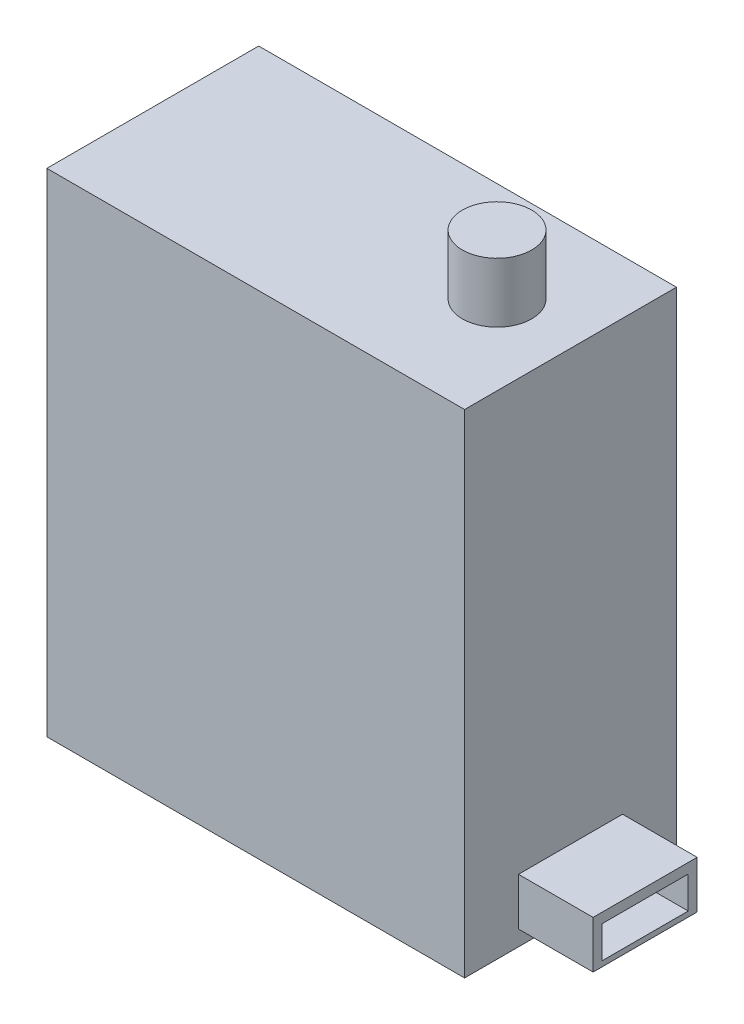
ISO-10303-21;
HEADER;
FILE_DESCRIPTION(('STEP AP214'),'2;1');
FILE_NAME('part.step','',(''),(''),'','','');
FILE_SCHEMA(('AUTOMOTIVE_DESIGN { 1 0 10303 214 1 1 1 1 }'));
ENDSEC;
DATA;
#1=APPLICATION_CONTEXT('core data for automotive mechanical design processes');
#2=APPLICATION_PROTOCOL_DEFINITION('international standard','automotive_design',2000,#1);
#3=PRODUCT_CONTEXT('',#1,'mechanical');
#4=PRODUCT('Part','Part','',(#3));
#5=PRODUCT_RELATED_PRODUCT_CATEGORY('part','',(#4));
#6=PRODUCT_DEFINITION_FORMATION('','',#4);
#7=PRODUCT_DEFINITION_CONTEXT('part definition',#1,'design');
#8=PRODUCT_DEFINITION('design','',#6,#7);
#9=PRODUCT_DEFINITION_SHAPE('','',#8);
#10=(LENGTH_UNIT() NAMED_UNIT(*) SI_UNIT(.MILLI.,.METRE.));
#11=(NAMED_UNIT(*) PLANE_ANGLE_UNIT() SI_UNIT($,.RADIAN.));
#12=(NAMED_UNIT(*) SI_UNIT($,.STERADIAN.) SOLID_ANGLE_UNIT());
#13=UNCERTAINTY_MEASURE_WITH_UNIT(LENGTH_MEASURE(1.E-05),#10,'distance_accuracy_value','');
#14=(GEOMETRIC_REPRESENTATION_CONTEXT(3) GLOBAL_UNCERTAINTY_ASSIGNED_CONTEXT((#13)) GLOBAL_UNIT_ASSIGNED_CONTEXT((#10,
#11,#12)) REPRESENTATION_CONTEXT('',''));
#15=CARTESIAN_POINT('',(0.,0.,0.));
#16=DIRECTION('',(0.,0.,1.));
#17=DIRECTION('',(1.,0.,0.));
#18=AXIS2_PLACEMENT_3D('',#15,#16,#17);
#19=CARTESIAN_POINT('',(0.,33.,0.));
#20=DIRECTION('',(-1.,0.,0.));
#21=DIRECTION('',(0.,0.,1.));
#22=AXIS2_PLACEMENT_3D('',#19,#20,#21);
#23=PLANE('',#22);
#24=DIRECTION('',(0.,0.,-1.));
#25=VECTOR('',#24,1.);
#26=CARTESIAN_POINT('',(0.,0.,0.));
#27=LINE('',#26,#25);
#28=CARTESIAN_POINT('',(0.,0.,0.));
#29=VERTEX_POINT('',#28);
#30=CARTESIAN_POINT('',(0.,0.,-14.2));
#31=VERTEX_POINT('',#30);
#32=EDGE_CURVE('E197',#29,#31,#27,.T.);
#33=ORIENTED_EDGE('',*,*,#32,.T.);
#34=DIRECTION('',(0.,-1.,0.));
#35=VECTOR('',#34,1.);
#36=CARTESIAN_POINT('',(0.,33.,-14.2));
#37=LINE('',#36,#35);
#38=CARTESIAN_POINT('',(0.,33.,-14.2));
#39=VERTEX_POINT('',#38);
#40=EDGE_CURVE('E11',#39,#31,#37,.T.);
#41=ORIENTED_EDGE('',*,*,#40,.F.);
#42=DIRECTION('',(0.,0.,-1.));
#43=VECTOR('',#42,1.);
#44=CARTESIAN_POINT('',(0.,33.,0.));
#45=LINE('',#44,#43);
#46=CARTESIAN_POINT('',(0.,33.,0.));
#47=VERTEX_POINT('',#46);
#48=EDGE_CURVE('E200',#47,#39,#45,.T.);
#49=ORIENTED_EDGE('',*,*,#48,.F.);
#50=DIRECTION('',(0.,-1.,0.));
#51=VECTOR('',#50,1.);
#52=CARTESIAN_POINT('',(0.,33.,0.));
#53=LINE('',#52,#51);
#54=EDGE_CURVE('E210',#47,#29,#53,.T.);
#55=ORIENTED_EDGE('',*,*,#54,.T.);
#56=EDGE_LOOP('',(#33,#41,#49,#55));
#57=FACE_BOUND('',#56,.T.);
#58=DIRECTION('',(0.,-1.,0.));
#59=VECTOR('',#58,1.);
#60=CARTESIAN_POINT('',(0.,1.03633654772768,-3.61262373338085));
#61=LINE('',#60,#59);
#62=CARTESIAN_POINT('',(0.,4.21264494239171,-3.61262373338085));
#63=VERTEX_POINT('',#62);
#64=CARTESIAN_POINT('',(0.,1.03633654772768,-3.61262373338085));
#65=VERTEX_POINT('',#64);
#66=EDGE_CURVE('E160',#63,#65,#61,.T.);
#67=ORIENTED_EDGE('',*,*,#66,.F.);
#68=DIRECTION('',(0.,0.,1.));
#69=VECTOR('',#68,1.);
#70=CARTESIAN_POINT('',(0.,4.21264494239171,-10.5873762666191));
#71=LINE('',#70,#69);
#72=CARTESIAN_POINT('',(0.,4.21264494239171,-10.5873762666191));
#73=VERTEX_POINT('',#72);
#74=EDGE_CURVE('E168',#73,#63,#71,.T.);
#75=ORIENTED_EDGE('',*,*,#74,.F.);
#76=DIRECTION('',(0.,1.,0.));
#77=VECTOR('',#76,1.);
#78=CARTESIAN_POINT('',(0.,1.03633654772768,-10.5873762666191));
#79=LINE('',#78,#77);
#80=CARTESIAN_POINT('',(0.,1.03633654772768,-10.5873762666191));
#81=VERTEX_POINT('',#80);
#82=EDGE_CURVE('E178',#81,#73,#79,.T.);
#83=ORIENTED_EDGE('',*,*,#82,.F.);
#84=DIRECTION('',(0.,0.,-1.));
#85=VECTOR('',#84,1.);
#86=CARTESIAN_POINT('',(0.,1.03633654772768,-10.5873762666191));
#87=LINE('',#86,#85);
#88=EDGE_CURVE('E59',#65,#81,#87,.T.);
#89=ORIENTED_EDGE('',*,*,#88,.F.);
#90=EDGE_LOOP('',(#67,#75,#83,#89));
#91=FACE_BOUND('',#90,.T.);
#92=ADVANCED_FACE('F37',(#57,#91),#23,.F.);
#93=CARTESIAN_POINT('',(0.,33.,-14.2));
#94=DIRECTION('',(0.,0.,1.));
#95=DIRECTION('',(1.,0.,0.));
#96=AXIS2_PLACEMENT_3D('',#93,#94,#95);
#97=PLANE('',#96);
#98=DIRECTION('',(-1.,0.,0.));
#99=VECTOR('',#98,1.);
#100=CARTESIAN_POINT('',(0.,0.,-14.2));
#101=LINE('',#100,#99);
#102=CARTESIAN_POINT('',(-28.,0.,-14.2));
#103=VERTEX_POINT('',#102);
#104=EDGE_CURVE('E213',#31,#103,#101,.T.);
#105=ORIENTED_EDGE('',*,*,#104,.T.);
#106=DIRECTION('',(0.,-1.,0.));
#107=VECTOR('',#106,1.);
#108=CARTESIAN_POINT('',(-28.,33.,-14.2));
#109=LINE('',#108,#107);
#110=CARTESIAN_POINT('',(-28.,33.,-14.2));
#111=VERTEX_POINT('',#110);
#112=EDGE_CURVE('E44',#111,#103,#109,.T.);
#113=ORIENTED_EDGE('',*,*,#112,.F.);
#114=DIRECTION('',(-1.,0.,0.));
#115=VECTOR('',#114,1.);
#116=CARTESIAN_POINT('',(0.,33.,-14.2));
#117=LINE('',#116,#115);
#118=EDGE_CURVE('E203',#39,#111,#117,.T.);
#119=ORIENTED_EDGE('',*,*,#118,.F.);
#120=ORIENTED_EDGE('',*,*,#40,.T.);
#121=EDGE_LOOP('',(#105,#113,#119,#120));
#122=FACE_BOUND('',#121,.T.);
#123=ADVANCED_FACE('F243',(#122),#97,.F.);
#124=CARTESIAN_POINT('',(-28.,33.,0.));
#125=DIRECTION('',(1.,0.,0.));
#126=DIRECTION('',(0.,0.,-1.));
#127=AXIS2_PLACEMENT_3D('',#124,#125,#126);
#128=PLANE('',#127);
#129=DIRECTION('',(0.,0.,1.));
#130=VECTOR('',#129,1.);
#131=CARTESIAN_POINT('',(-28.,0.,0.));
#132=LINE('',#131,#130);
#133=CARTESIAN_POINT('',(-28.,0.,0.));
#134=VERTEX_POINT('',#133);
#135=EDGE_CURVE('E215',#103,#134,#132,.T.);
#136=ORIENTED_EDGE('',*,*,#135,.T.);
#137=DIRECTION('',(0.,-1.,0.));
#138=VECTOR('',#137,1.);
#139=CARTESIAN_POINT('',(-28.,33.,0.));
#140=LINE('',#139,#138);
#141=CARTESIAN_POINT('',(-28.,33.,0.));
#142=VERTEX_POINT('',#141);
#143=EDGE_CURVE('E220',#142,#134,#140,.T.);
#144=ORIENTED_EDGE('',*,*,#143,.F.);
#145=DIRECTION('',(0.,0.,1.));
#146=VECTOR('',#145,1.);
#147=CARTESIAN_POINT('',(-28.,33.,0.));
#148=LINE('',#147,#146);
#149=EDGE_CURVE('E206',#111,#142,#148,.T.);
#150=ORIENTED_EDGE('',*,*,#149,.F.);
#151=ORIENTED_EDGE('',*,*,#112,.T.);
#152=EDGE_LOOP('',(#136,#144,#150,#151));
#153=FACE_BOUND('',#152,.T.);
#154=ADVANCED_FACE('F227',(#153),#128,.F.);
#155=CARTESIAN_POINT('',(0.,33.,0.));
#156=DIRECTION('',(0.,0.,-1.));
#157=DIRECTION('',(-1.,0.,0.));
#158=AXIS2_PLACEMENT_3D('',#155,#156,#157);
#159=PLANE('',#158);
#160=DIRECTION('',(1.,0.,0.));
#161=VECTOR('',#160,1.);
#162=CARTESIAN_POINT('',(0.,0.,0.));
#163=LINE('',#162,#161);
#164=EDGE_CURVE('E204',#134,#29,#163,.T.);
#165=ORIENTED_EDGE('',*,*,#164,.T.);
#166=ORIENTED_EDGE('',*,*,#54,.F.);
#167=DIRECTION('',(1.,0.,0.));
#168=VECTOR('',#167,1.);
#169=CARTESIAN_POINT('',(0.,33.,0.));
#170=LINE('',#169,#168);
#171=EDGE_CURVE('E208',#142,#47,#170,.T.);
#172=ORIENTED_EDGE('',*,*,#171,.F.);
#173=ORIENTED_EDGE('',*,*,#143,.T.);
#174=EDGE_LOOP('',(#165,#166,#172,#173));
#175=FACE_BOUND('',#174,.T.);
#176=ADVANCED_FACE('F236',(#175),#159,.F.);
#177=CARTESIAN_POINT('',(0.,33.,0.));
#178=DIRECTION('',(0.,1.,0.));
#179=DIRECTION('',(0.,0.,1.));
#180=AXIS2_PLACEMENT_3D('',#177,#178,#179);
#181=PLANE('',#180);
#182=CARTESIAN_POINT('',(-5.33154291204438,33.,-7.50633392599804));
#183=DIRECTION('',(0.,1.,0.));
#184=DIRECTION('',(0.,0.,1.));
#185=AXIS2_PLACEMENT_3D('',#182,#183,#184);
#186=CIRCLE('',#185,2.32190814855954);
#187=CARTESIAN_POINT('',(-5.33154291204438,33.,-5.1844257774385));
#188=VERTEX_POINT('',#187);
#189=EDGE_CURVE('E193',#188,#188,#186,.T.);
#190=ORIENTED_EDGE('',*,*,#189,.F.);
#191=EDGE_LOOP('',(#190));
#192=FACE_BOUND('',#191,.T.);
#193=ORIENTED_EDGE('',*,*,#48,.T.);
#194=ORIENTED_EDGE('',*,*,#118,.T.);
#195=ORIENTED_EDGE('',*,*,#149,.T.);
#196=ORIENTED_EDGE('',*,*,#171,.T.);
#197=EDGE_LOOP('',(#193,#194,#195,#196));
#198=FACE_BOUND('',#197,.T.);
#199=ADVANCED_FACE('F242',(#192,#198),#181,.T.);
#200=CARTESIAN_POINT('',(0.,0.,0.));
#201=DIRECTION('',(0.,1.,0.));
#202=DIRECTION('',(0.,0.,1.));
#203=AXIS2_PLACEMENT_3D('',#200,#201,#202);
#204=PLANE('',#203);
#205=ORIENTED_EDGE('',*,*,#32,.F.);
#206=ORIENTED_EDGE('',*,*,#164,.F.);
#207=ORIENTED_EDGE('',*,*,#135,.F.);
#208=ORIENTED_EDGE('',*,*,#104,.F.);
#209=EDGE_LOOP('',(#205,#206,#207,#208));
#210=FACE_BOUND('',#209,.T.);
#211=ADVANCED_FACE('F233',(#210),#204,.F.);
#212=CARTESIAN_POINT('',(-5.33154291204438,37.,-7.50633392599804));
#213=DIRECTION('',(0.,-1.,0.));
#214=DIRECTION('',(0.,0.,-1.));
#215=AXIS2_PLACEMENT_3D('',#212,#213,#214);
#216=CYLINDRICAL_SURFACE('',#215,2.32190814855954);
#217=CARTESIAN_POINT('',(-5.33154291204438,37.,-7.50633392599804));
#218=DIRECTION('',(0.,1.,0.));
#219=DIRECTION('',(0.,0.,1.));
#220=AXIS2_PLACEMENT_3D('',#217,#218,#219);
#221=CIRCLE('',#220,2.32190814855954);
#222=CARTESIAN_POINT('',(-5.33154291204438,37.,-5.1844257774385));
#223=VERTEX_POINT('',#222);
#224=EDGE_CURVE('E194',#223,#223,#221,.T.);
#225=ORIENTED_EDGE('',*,*,#224,.F.);
#226=EDGE_LOOP('',(#225));
#227=FACE_BOUND('',#226,.T.);
#228=ORIENTED_EDGE('',*,*,#189,.T.);
#229=EDGE_LOOP('',(#228));
#230=FACE_BOUND('',#229,.T.);
#231=ADVANCED_FACE('F255',(#227,#230),#216,.T.);
#232=CARTESIAN_POINT('',(-5.33154291204438,37.,-7.50633392599804));
#233=DIRECTION('',(0.,1.,0.));
#234=DIRECTION('',(0.,0.,1.));
#235=AXIS2_PLACEMENT_3D('',#232,#233,#234);
#236=PLANE('',#235);
#237=ORIENTED_EDGE('',*,*,#224,.T.);
#238=EDGE_LOOP('',(#237));
#239=FACE_BOUND('',#238,.T.);
#240=ADVANCED_FACE('F261',(#239),#236,.T.);
#241=CARTESIAN_POINT('',(5.,1.03633654772768,-3.61262373338085));
#242=DIRECTION('',(0.,0.,-1.));
#243=DIRECTION('',(-1.,0.,0.));
#244=AXIS2_PLACEMENT_3D('',#241,#242,#243);
#245=PLANE('',#244);
#246=ORIENTED_EDGE('',*,*,#66,.T.);
#247=DIRECTION('',(-1.,0.,0.));
#248=VECTOR('',#247,1.);
#249=CARTESIAN_POINT('',(5.,1.03633654772768,-3.61262373338085));
#250=LINE('',#249,#248);
#251=CARTESIAN_POINT('',(5.,1.03633654772768,-3.61262373338085));
#252=VERTEX_POINT('',#251);
#253=EDGE_CURVE('E191',#252,#65,#250,.T.);
#254=ORIENTED_EDGE('',*,*,#253,.F.);
#255=DIRECTION('',(0.,-1.,0.));
#256=VECTOR('',#255,1.);
#257=CARTESIAN_POINT('',(5.,1.03633654772768,-3.61262373338085));
#258=LINE('',#257,#256);
#259=CARTESIAN_POINT('',(5.,4.21264494239171,-3.61262373338085));
#260=VERTEX_POINT('',#259);
#261=EDGE_CURVE('E164',#260,#252,#258,.T.);
#262=ORIENTED_EDGE('',*,*,#261,.F.);
#263=DIRECTION('',(-1.,0.,0.));
#264=VECTOR('',#263,1.);
#265=CARTESIAN_POINT('',(5.,4.21264494239171,-3.61262373338085));
#266=LINE('',#265,#264);
#267=EDGE_CURVE('E174',#260,#63,#266,.T.);
#268=ORIENTED_EDGE('',*,*,#267,.T.);
#269=EDGE_LOOP('',(#246,#254,#262,#268));
#270=FACE_BOUND('',#269,.T.);
#271=ADVANCED_FACE('F265',(#270),#245,.F.);
#272=CARTESIAN_POINT('',(5.,1.03633654772768,-10.5873762666191));
#273=DIRECTION('',(0.,1.,0.));
#274=DIRECTION('',(0.,0.,1.));
#275=AXIS2_PLACEMENT_3D('',#272,#273,#274);
#276=PLANE('',#275);
#277=ORIENTED_EDGE('',*,*,#88,.T.);
#278=DIRECTION('',(-1.,0.,0.));
#279=VECTOR('',#278,1.);
#280=CARTESIAN_POINT('',(5.,1.03633654772768,-10.5873762666191));
#281=LINE('',#280,#279);
#282=CARTESIAN_POINT('',(5.,1.03633654772768,-10.5873762666191));
#283=VERTEX_POINT('',#282);
#284=EDGE_CURVE('E188',#283,#81,#281,.T.);
#285=ORIENTED_EDGE('',*,*,#284,.F.);
#286=DIRECTION('',(0.,0.,-1.));
#287=VECTOR('',#286,1.);
#288=CARTESIAN_POINT('',(5.,1.03633654772768,-10.5873762666191));
#289=LINE('',#288,#287);
#290=EDGE_CURVE('E167',#252,#283,#289,.T.);
#291=ORIENTED_EDGE('',*,*,#290,.F.);
#292=ORIENTED_EDGE('',*,*,#253,.T.);
#293=EDGE_LOOP('',(#277,#285,#291,#292));
#294=FACE_BOUND('',#293,.T.);
#295=ADVANCED_FACE('F269',(#294),#276,.F.);
#296=CARTESIAN_POINT('',(5.,1.03633654772768,-10.5873762666191));
#297=DIRECTION('',(0.,0.,1.));
#298=DIRECTION('',(1.,0.,0.));
#299=AXIS2_PLACEMENT_3D('',#296,#297,#298);
#300=PLANE('',#299);
#301=ORIENTED_EDGE('',*,*,#82,.T.);
#302=DIRECTION('',(-1.,0.,0.));
#303=VECTOR('',#302,1.);
#304=CARTESIAN_POINT('',(5.,4.21264494239171,-10.5873762666191));
#305=LINE('',#304,#303);
#306=CARTESIAN_POINT('',(5.,4.21264494239171,-10.5873762666191));
#307=VERTEX_POINT('',#306);
#308=EDGE_CURVE('E185',#307,#73,#305,.T.);
#309=ORIENTED_EDGE('',*,*,#308,.F.);
#310=DIRECTION('',(0.,1.,0.));
#311=VECTOR('',#310,1.);
#312=CARTESIAN_POINT('',(5.,1.03633654772768,-10.5873762666191));
#313=LINE('',#312,#311);
#314=EDGE_CURVE('E170',#283,#307,#313,.T.);
#315=ORIENTED_EDGE('',*,*,#314,.F.);
#316=ORIENTED_EDGE('',*,*,#284,.T.);
#317=EDGE_LOOP('',(#301,#309,#315,#316));
#318=FACE_BOUND('',#317,.T.);
#319=ADVANCED_FACE('F273',(#318),#300,.F.);
#320=CARTESIAN_POINT('',(5.,4.21264494239171,-10.5873762666191));
#321=DIRECTION('',(0.,-1.,0.));
#322=DIRECTION('',(0.,0.,-1.));
#323=AXIS2_PLACEMENT_3D('',#320,#321,#322);
#324=PLANE('',#323);
#325=ORIENTED_EDGE('',*,*,#74,.T.);
#326=ORIENTED_EDGE('',*,*,#267,.F.);
#327=DIRECTION('',(0.,0.,1.));
#328=VECTOR('',#327,1.);
#329=CARTESIAN_POINT('',(5.,4.21264494239171,-10.5873762666191));
#330=LINE('',#329,#328);
#331=EDGE_CURVE('E172',#307,#260,#330,.T.);
#332=ORIENTED_EDGE('',*,*,#331,.F.);
#333=ORIENTED_EDGE('',*,*,#308,.T.);
#334=EDGE_LOOP('',(#325,#326,#332,#333));
#335=FACE_BOUND('',#334,.T.);
#336=ADVANCED_FACE('F277',(#335),#324,.F.);
#337=CARTESIAN_POINT('',(5.,0.,0.));
#338=DIRECTION('',(1.,0.,0.));
#339=DIRECTION('',(0.,0.,-1.));
#340=AXIS2_PLACEMENT_3D('',#337,#338,#339);
#341=PLANE('',#340);
#342=DIRECTION('',(0.,1.,0.));
#343=VECTOR('',#342,1.);
#344=CARTESIAN_POINT('',(5.,1.39297741903932,-9.98876287969833));
#345=LINE('',#344,#343);
#346=CARTESIAN_POINT('',(5.,1.39297741903932,-9.98876287969833));
#347=VERTEX_POINT('',#346);
#348=CARTESIAN_POINT('',(5.,3.54275444579156,-9.98876287969833));
#349=VERTEX_POINT('',#348);
#350=EDGE_CURVE('E51',#347,#349,#345,.T.);
#351=ORIENTED_EDGE('',*,*,#350,.F.);
#352=DIRECTION('',(0.,0.,-1.));
#353=VECTOR('',#352,1.);
#354=CARTESIAN_POINT('',(5.,1.39297741903932,-4.21123712030167));
#355=LINE('',#354,#353);
#356=CARTESIAN_POINT('',(5.,1.39297741903932,-4.21123712030167));
#357=VERTEX_POINT('',#356);
#358=EDGE_CURVE('E145',#357,#347,#355,.T.);
#359=ORIENTED_EDGE('',*,*,#358,.F.);
#360=DIRECTION('',(0.,-1.,0.));
#361=VECTOR('',#360,1.);
#362=CARTESIAN_POINT('',(5.,1.39297741903932,-4.21123712030167));
#363=LINE('',#362,#361);
#364=CARTESIAN_POINT('',(5.,3.54275444579156,-4.21123712030167));
#365=VERTEX_POINT('',#364);
#366=EDGE_CURVE('E148',#365,#357,#363,.T.);
#367=ORIENTED_EDGE('',*,*,#366,.F.);
#368=DIRECTION('',(0.,0.,1.));
#369=VECTOR('',#368,1.);
#370=CARTESIAN_POINT('',(5.,3.54275444579156,-4.21123712030167));
#371=LINE('',#370,#369);
#372=EDGE_CURVE('E154',#349,#365,#371,.T.);
#373=ORIENTED_EDGE('',*,*,#372,.F.);
#374=EDGE_LOOP('',(#351,#359,#367,#373));
#375=FACE_BOUND('',#374,.T.);
#376=ORIENTED_EDGE('',*,*,#261,.T.);
#377=ORIENTED_EDGE('',*,*,#290,.T.);
#378=ORIENTED_EDGE('',*,*,#314,.T.);
#379=ORIENTED_EDGE('',*,*,#331,.T.);
#380=EDGE_LOOP('',(#376,#377,#378,#379));
#381=FACE_BOUND('',#380,.T.);
#382=ADVANCED_FACE('F281',(#375,#381),#341,.T.);
#383=CARTESIAN_POINT('',(0.,1.39297741903932,-9.98876287969833));
#384=DIRECTION('',(0.,0.,-1.));
#385=DIRECTION('',(-1.,0.,0.));
#386=AXIS2_PLACEMENT_3D('',#383,#384,#385);
#387=PLANE('',#386);
#388=ORIENTED_EDGE('',*,*,#350,.T.);
#389=DIRECTION('',(1.,0.,0.));
#390=VECTOR('',#389,1.);
#391=CARTESIAN_POINT('',(0.,3.54275444579156,-9.98876287969833));
#392=LINE('',#391,#390);
#393=CARTESIAN_POINT('',(0.,3.54275444579156,-9.98876287969833));
#394=VERTEX_POINT('',#393);
#395=EDGE_CURVE('E123',#394,#349,#392,.T.);
#396=ORIENTED_EDGE('',*,*,#395,.F.);
#397=DIRECTION('',(0.,1.,0.));
#398=VECTOR('',#397,1.);
#399=CARTESIAN_POINT('',(0.,1.39297741903932,-9.98876287969833));
#400=LINE('',#399,#398);
#401=CARTESIAN_POINT('',(0.,1.39297741903932,-9.98876287969833));
#402=VERTEX_POINT('',#401);
#403=EDGE_CURVE('E127',#402,#394,#400,.T.);
#404=ORIENTED_EDGE('',*,*,#403,.F.);
#405=DIRECTION('',(1.,0.,0.));
#406=VECTOR('',#405,1.);
#407=CARTESIAN_POINT('',(0.,1.39297741903932,-9.98876287969833));
#408=LINE('',#407,#406);
#409=EDGE_CURVE('E158',#402,#347,#408,.T.);
#410=ORIENTED_EDGE('',*,*,#409,.T.);
#411=EDGE_LOOP('',(#388,#396,#404,#410));
#412=FACE_BOUND('',#411,.T.);
#413=ADVANCED_FACE('F125',(#412),#387,.F.);
#414=CARTESIAN_POINT('',(0.,1.39297741903932,-4.21123712030167));
#415=DIRECTION('',(0.,-1.,0.));
#416=DIRECTION('',(0.,0.,-1.));
#417=AXIS2_PLACEMENT_3D('',#414,#415,#416);
#418=PLANE('',#417);
#419=ORIENTED_EDGE('',*,*,#358,.T.);
#420=ORIENTED_EDGE('',*,*,#409,.F.);
#421=DIRECTION('',(0.,0.,-1.));
#422=VECTOR('',#421,1.);
#423=CARTESIAN_POINT('',(0.,1.39297741903932,-4.21123712030167));
#424=LINE('',#423,#422);
#425=CARTESIAN_POINT('',(0.,1.39297741903932,-4.21123712030167));
#426=VERTEX_POINT('',#425);
#427=EDGE_CURVE('E133',#426,#402,#424,.T.);
#428=ORIENTED_EDGE('',*,*,#427,.F.);
#429=DIRECTION('',(1.,0.,0.));
#430=VECTOR('',#429,1.);
#431=CARTESIAN_POINT('',(0.,1.39297741903932,-4.21123712030167));
#432=LINE('',#431,#430);
#433=EDGE_CURVE('E161',#426,#357,#432,.T.);
#434=ORIENTED_EDGE('',*,*,#433,.T.);
#435=EDGE_LOOP('',(#419,#420,#428,#434));
#436=FACE_BOUND('',#435,.T.);
#437=ADVANCED_FACE('F288',(#436),#418,.F.);
#438=CARTESIAN_POINT('',(0.,1.39297741903932,-4.21123712030167));
#439=DIRECTION('',(0.,0.,1.));
#440=DIRECTION('',(1.,0.,0.));
#441=AXIS2_PLACEMENT_3D('',#438,#439,#440);
#442=PLANE('',#441);
#443=ORIENTED_EDGE('',*,*,#366,.T.);
#444=ORIENTED_EDGE('',*,*,#433,.F.);
#445=DIRECTION('',(0.,-1.,0.));
#446=VECTOR('',#445,1.);
#447=CARTESIAN_POINT('',(0.,1.39297741903932,-4.21123712030167));
#448=LINE('',#447,#446);
#449=CARTESIAN_POINT('',(0.,3.54275444579156,-4.21123712030167));
#450=VERTEX_POINT('',#449);
#451=EDGE_CURVE('E141',#450,#426,#448,.T.);
#452=ORIENTED_EDGE('',*,*,#451,.F.);
#453=DIRECTION('',(1.,0.,0.));
#454=VECTOR('',#453,1.);
#455=CARTESIAN_POINT('',(0.,3.54275444579156,-4.21123712030167));
#456=LINE('',#455,#454);
#457=EDGE_CURVE('E132',#450,#365,#456,.T.);
#458=ORIENTED_EDGE('',*,*,#457,.T.);
#459=EDGE_LOOP('',(#443,#444,#452,#458));
#460=FACE_BOUND('',#459,.T.);
#461=ADVANCED_FACE('F291',(#460),#442,.F.);
#462=CARTESIAN_POINT('',(0.,3.54275444579156,-4.21123712030167));
#463=DIRECTION('',(0.,1.,0.));
#464=DIRECTION('',(0.,0.,1.));
#465=AXIS2_PLACEMENT_3D('',#462,#463,#464);
#466=PLANE('',#465);
#467=ORIENTED_EDGE('',*,*,#372,.T.);
#468=ORIENTED_EDGE('',*,*,#457,.F.);
#469=DIRECTION('',(0.,0.,1.));
#470=VECTOR('',#469,1.);
#471=CARTESIAN_POINT('',(0.,3.54275444579156,-4.21123712030167));
#472=LINE('',#471,#470);
#473=EDGE_CURVE('E136',#394,#450,#472,.T.);
#474=ORIENTED_EDGE('',*,*,#473,.F.);
#475=ORIENTED_EDGE('',*,*,#395,.T.);
#476=EDGE_LOOP('',(#467,#468,#474,#475));
#477=FACE_BOUND('',#476,.T.);
#478=ADVANCED_FACE('F137',(#477),#466,.F.);
#479=CARTESIAN_POINT('',(0.,0.,0.));
#480=DIRECTION('',(-1.,0.,0.));
#481=DIRECTION('',(0.,0.,1.));
#482=AXIS2_PLACEMENT_3D('',#479,#480,#481);
#483=PLANE('',#482);
#484=ORIENTED_EDGE('',*,*,#403,.T.);
#485=ORIENTED_EDGE('',*,*,#473,.T.);
#486=ORIENTED_EDGE('',*,*,#451,.T.);
#487=ORIENTED_EDGE('',*,*,#427,.T.);
#488=EDGE_LOOP('',(#484,#485,#486,#487));
#489=FACE_BOUND('',#488,.T.);
#490=ADVANCED_FACE('F143',(#489),#483,.F.);
#491=CLOSED_SHELL('',(#92,#123,#154,#176,#199,#211,#231,#240,#271,#295,#319,#336,#382,#413,#437,
#461,#478,#490));
#492=MANIFOLD_SOLID_BREP('B2',#491);
#493=ADVANCED_BREP_SHAPE_REPRESENTATION('',(#18,#492),#14);
#494=SHAPE_DEFINITION_REPRESENTATION(#9,#493);
ENDSEC;
END-ISO-10303-21;
